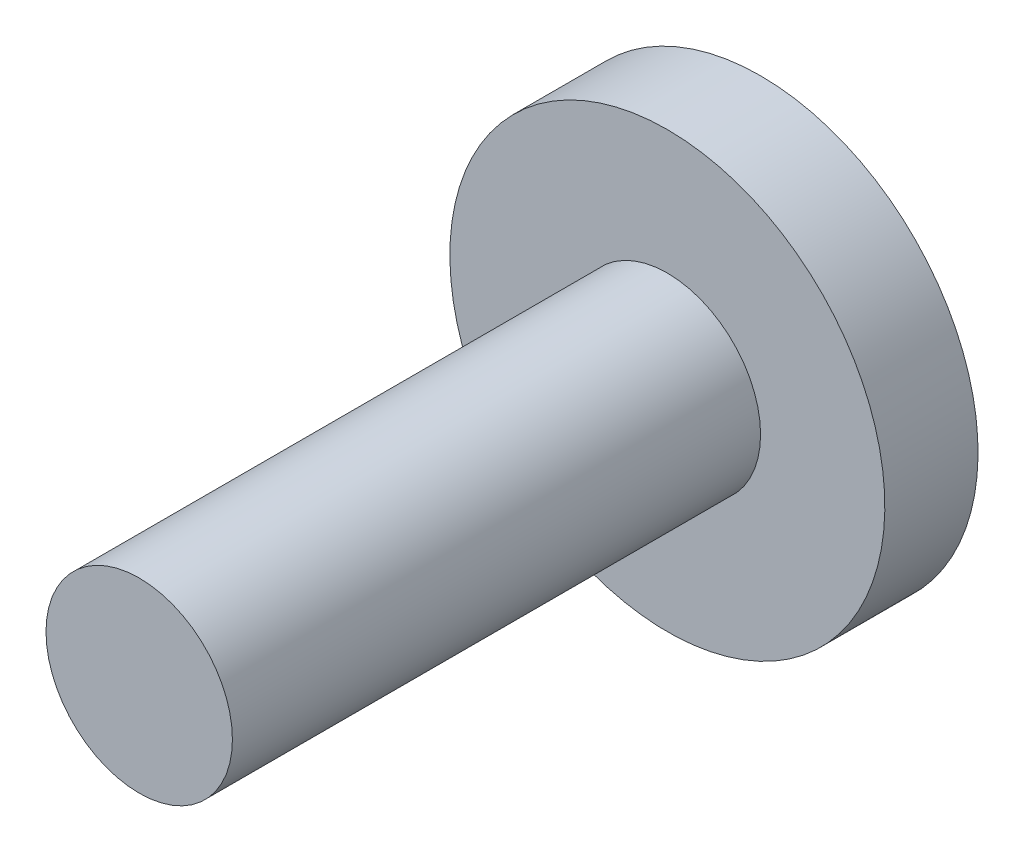
ISO-10303-21;
HEADER;
FILE_DESCRIPTION(('STEP AP214'),'2;1');
FILE_NAME('part.step','',(''),(''),'','','');
FILE_SCHEMA(('AUTOMOTIVE_DESIGN { 1 0 10303 214 1 1 1 1 }'));
ENDSEC;
DATA;
#1=APPLICATION_CONTEXT('core data for automotive mechanical design processes');
#2=APPLICATION_PROTOCOL_DEFINITION('international standard','automotive_design',2000,#1);
#3=PRODUCT_CONTEXT('',#1,'mechanical');
#4=PRODUCT('Part','Part','',(#3));
#5=PRODUCT_RELATED_PRODUCT_CATEGORY('part','',(#4));
#6=PRODUCT_DEFINITION_FORMATION('','',#4);
#7=PRODUCT_DEFINITION_CONTEXT('part definition',#1,'design');
#8=PRODUCT_DEFINITION('design','',#6,#7);
#9=PRODUCT_DEFINITION_SHAPE('','',#8);
#10=(LENGTH_UNIT() NAMED_UNIT(*) SI_UNIT(.MILLI.,.METRE.));
#11=(NAMED_UNIT(*) PLANE_ANGLE_UNIT() SI_UNIT($,.RADIAN.));
#12=(NAMED_UNIT(*) SI_UNIT($,.STERADIAN.) SOLID_ANGLE_UNIT());
#13=UNCERTAINTY_MEASURE_WITH_UNIT(LENGTH_MEASURE(1.E-05),#10,'distance_accuracy_value','');
#14=(GEOMETRIC_REPRESENTATION_CONTEXT(3) GLOBAL_UNCERTAINTY_ASSIGNED_CONTEXT((#13)) GLOBAL_UNIT_ASSIGNED_CONTEXT((#10,
#11,#12)) REPRESENTATION_CONTEXT('',''));
#15=CARTESIAN_POINT('',(0.,0.,0.));
#16=DIRECTION('',(0.,0.,1.));
#17=DIRECTION('',(1.,0.,0.));
#18=AXIS2_PLACEMENT_3D('',#15,#16,#17);
#19=CARTESIAN_POINT('',(131.385564386284,104.456236842962,355.624757541019));
#20=DIRECTION('',(0.,0.,-1.));
#21=DIRECTION('',(0.,-1.,0.));
#22=AXIS2_PLACEMENT_3D('',#19,#20,#21);
#23=PLANE('',#22);
#24=DIRECTION('',(0.,-1.,0.));
#25=VECTOR('',#24,1.);
#26=CARTESIAN_POINT('',(130.135564386284,105.17792467945,355.624757541019));
#27=LINE('',#26,#25);
#28=CARTESIAN_POINT('',(130.135564386284,105.17792467945,355.624757541019));
#29=VERTEX_POINT('',#28);
#30=CARTESIAN_POINT('',(130.135564386284,103.734549006475,355.624757541019));
#31=VERTEX_POINT('',#30);
#32=EDGE_CURVE('E155',#29,#31,#27,.T.);
#33=ORIENTED_EDGE('',*,*,#32,.F.);
#34=DIRECTION('',(-0.866025403784439,-0.5,0.));
#35=VECTOR('',#34,1.);
#36=CARTESIAN_POINT('',(131.385564386284,105.899612515937,355.624757541019));
#37=LINE('',#36,#35);
#38=CARTESIAN_POINT('',(131.385564386284,105.899612515937,355.624757541019));
#39=VERTEX_POINT('',#38);
#40=EDGE_CURVE('E137',#39,#29,#37,.T.);
#41=ORIENTED_EDGE('',*,*,#40,.F.);
#42=DIRECTION('',(-0.866025403784439,0.5,0.));
#43=VECTOR('',#42,1.);
#44=CARTESIAN_POINT('',(132.635564386284,105.17792467945,355.624757541019));
#45=LINE('',#44,#43);
#46=CARTESIAN_POINT('',(132.635564386284,105.17792467945,355.624757541019));
#47=VERTEX_POINT('',#46);
#48=EDGE_CURVE('E135',#47,#39,#45,.T.);
#49=ORIENTED_EDGE('',*,*,#48,.F.);
#50=DIRECTION('',(0.,1.,0.));
#51=VECTOR('',#50,1.);
#52=CARTESIAN_POINT('',(132.635564386284,103.734549006475,355.624757541019));
#53=LINE('',#52,#51);
#54=CARTESIAN_POINT('',(132.635564386284,103.734549006475,355.624757541019));
#55=VERTEX_POINT('',#54);
#56=EDGE_CURVE('E121',#55,#47,#53,.T.);
#57=ORIENTED_EDGE('',*,*,#56,.F.);
#58=DIRECTION('',(-0.866025403784439,-0.5,0.));
#59=VECTOR('',#58,1.);
#60=CARTESIAN_POINT('',(131.385564386284,103.012861169988,355.624757541019));
#61=LINE('',#60,#59);
#62=CARTESIAN_POINT('',(131.385564386284,103.012861169988,355.624757541019));
#63=VERTEX_POINT('',#62);
#64=EDGE_CURVE('E53',#55,#63,#61,.T.);
#65=ORIENTED_EDGE('',*,*,#64,.T.);
#66=DIRECTION('',(-0.866025403784438,0.5,0.));
#67=VECTOR('',#66,1.);
#68=CARTESIAN_POINT('',(130.135564386284,103.734549006475,355.624757541019));
#69=LINE('',#68,#67);
#70=EDGE_CURVE('E11',#63,#31,#69,.T.);
#71=ORIENTED_EDGE('',*,*,#70,.T.);
#72=EDGE_LOOP('',(#33,#41,#49,#57,#65,#71));
#73=FACE_BOUND('',#72,.T.);
#74=ADVANCED_FACE('F42',(#73),#23,.T.);
#75=CARTESIAN_POINT('',(130.135564386284,103.734549006475,351.424757541018));
#76=DIRECTION('',(0.5,0.866025403784438,0.));
#77=DIRECTION('',(0.,0.,-1.));
#78=AXIS2_PLACEMENT_3D('',#75,#76,#77);
#79=PLANE('',#78);
#80=DIRECTION('',(0.,0.,-1.));
#81=VECTOR('',#80,1.);
#82=CARTESIAN_POINT('',(131.385564386284,103.012861169988,351.424757541018));
#83=LINE('',#82,#81);
#84=CARTESIAN_POINT('',(131.385564386284,103.012861169988,354.624757541019));
#85=VERTEX_POINT('',#84);
#86=EDGE_CURVE('E132',#63,#85,#83,.T.);
#87=ORIENTED_EDGE('',*,*,#86,.T.);
#88=DIRECTION('',(-0.866025403784438,0.5,0.));
#89=VECTOR('',#88,1.);
#90=CARTESIAN_POINT('',(130.760564386284,103.373705088232,354.624757541019));
#91=LINE('',#90,#89);
#92=CARTESIAN_POINT('',(130.135564386284,103.734549006475,354.624757541019));
#93=VERTEX_POINT('',#92);
#94=EDGE_CURVE('E165',#85,#93,#91,.T.);
#95=ORIENTED_EDGE('',*,*,#94,.T.);
#96=DIRECTION('',(0.,0.,-1.));
#97=VECTOR('',#96,1.);
#98=CARTESIAN_POINT('',(130.135564386284,103.734549006475,351.424757541018));
#99=LINE('',#98,#97);
#100=EDGE_CURVE('E167',#31,#93,#99,.T.);
#101=ORIENTED_EDGE('',*,*,#100,.F.);
#102=ORIENTED_EDGE('',*,*,#70,.F.);
#103=EDGE_LOOP('',(#87,#95,#101,#102));
#104=FACE_BOUND('',#103,.T.);
#105=ADVANCED_FACE('F44',(#104),#79,.T.);
#106=CARTESIAN_POINT('',(131.385564386284,103.012861169988,351.424757541018));
#107=DIRECTION('',(-0.5,0.866025403784439,0.));
#108=DIRECTION('',(0.,0.,1.));
#109=AXIS2_PLACEMENT_3D('',#106,#107,#108);
#110=PLANE('',#109);
#111=DIRECTION('',(0.,0.,-1.));
#112=VECTOR('',#111,1.);
#113=CARTESIAN_POINT('',(132.635564386284,103.734549006475,351.424757541018));
#114=LINE('',#113,#112);
#115=CARTESIAN_POINT('',(132.635564386284,103.734549006475,354.624757541019));
#116=VERTEX_POINT('',#115);
#117=EDGE_CURVE('E129',#55,#116,#114,.T.);
#118=ORIENTED_EDGE('',*,*,#117,.T.);
#119=DIRECTION('',(-0.866025403784439,-0.5,0.));
#120=VECTOR('',#119,1.);
#121=CARTESIAN_POINT('',(132.010564386284,103.373705088232,354.624757541019));
#122=LINE('',#121,#120);
#123=EDGE_CURVE('E160',#116,#85,#122,.T.);
#124=ORIENTED_EDGE('',*,*,#123,.T.);
#125=ORIENTED_EDGE('',*,*,#86,.F.);
#126=ORIENTED_EDGE('',*,*,#64,.F.);
#127=EDGE_LOOP('',(#118,#124,#125,#126));
#128=FACE_BOUND('',#127,.T.);
#129=ADVANCED_FACE('F215',(#128),#110,.T.);
#130=CARTESIAN_POINT('',(132.635564386284,103.734549006475,351.424757541018));
#131=DIRECTION('',(-1.,0.,0.));
#132=DIRECTION('',(0.,0.,1.));
#133=AXIS2_PLACEMENT_3D('',#130,#131,#132);
#134=PLANE('',#133);
#135=DIRECTION('',(0.,0.,-1.));
#136=VECTOR('',#135,1.);
#137=CARTESIAN_POINT('',(132.635564386284,105.177924679449,351.424757541018));
#138=LINE('',#137,#136);
#139=CARTESIAN_POINT('',(132.635564386284,105.177924679449,354.624757541019));
#140=VERTEX_POINT('',#139);
#141=EDGE_CURVE('E126',#47,#140,#138,.T.);
#142=ORIENTED_EDGE('',*,*,#141,.T.);
#143=DIRECTION('',(0.,-1.,0.));
#144=VECTOR('',#143,1.);
#145=CARTESIAN_POINT('',(132.635564386284,104.456236842962,354.624757541019));
#146=LINE('',#145,#144);
#147=EDGE_CURVE('E164',#140,#116,#146,.T.);
#148=ORIENTED_EDGE('',*,*,#147,.T.);
#149=ORIENTED_EDGE('',*,*,#117,.F.);
#150=ORIENTED_EDGE('',*,*,#56,.T.);
#151=EDGE_LOOP('',(#142,#148,#149,#150));
#152=FACE_BOUND('',#151,.T.);
#153=ADVANCED_FACE('F123',(#152),#134,.T.);
#154=CARTESIAN_POINT('',(132.635564386284,105.177924679449,351.424757541018));
#155=DIRECTION('',(-0.5,-0.866025403784439,0.));
#156=DIRECTION('',(-0.866025403784439,0.5,0.));
#157=AXIS2_PLACEMENT_3D('',#154,#155,#156);
#158=PLANE('',#157);
#159=DIRECTION('',(0.,0.,-1.));
#160=VECTOR('',#159,1.);
#161=CARTESIAN_POINT('',(131.385564386284,105.899612515937,351.424757541018));
#162=LINE('',#161,#160);
#163=CARTESIAN_POINT('',(131.385564386284,105.899612515937,354.624757541019));
#164=VERTEX_POINT('',#163);
#165=EDGE_CURVE('E151',#39,#164,#162,.T.);
#166=ORIENTED_EDGE('',*,*,#165,.T.);
#167=DIRECTION('',(0.866025403784439,-0.5,0.));
#168=VECTOR('',#167,1.);
#169=CARTESIAN_POINT('',(132.010564386284,105.538768597693,354.624757541019));
#170=LINE('',#169,#168);
#171=EDGE_CURVE('E144',#164,#140,#170,.T.);
#172=ORIENTED_EDGE('',*,*,#171,.T.);
#173=ORIENTED_EDGE('',*,*,#141,.F.);
#174=ORIENTED_EDGE('',*,*,#48,.T.);
#175=EDGE_LOOP('',(#166,#172,#173,#174));
#176=FACE_BOUND('',#175,.T.);
#177=ADVANCED_FACE('F142',(#176),#158,.T.);
#178=CARTESIAN_POINT('',(131.385564386284,105.899612515937,351.424757541018));
#179=DIRECTION('',(0.5,-0.866025403784439,0.));
#180=DIRECTION('',(0.,0.,-1.));
#181=AXIS2_PLACEMENT_3D('',#178,#179,#180);
#182=PLANE('',#181);
#183=DIRECTION('',(0.,0.,-1.));
#184=VECTOR('',#183,1.);
#185=CARTESIAN_POINT('',(130.135564386284,105.17792467945,351.424757541018));
#186=LINE('',#185,#184);
#187=CARTESIAN_POINT('',(130.135564386284,105.17792467945,354.624757541019));
#188=VERTEX_POINT('',#187);
#189=EDGE_CURVE('E159',#29,#188,#186,.T.);
#190=ORIENTED_EDGE('',*,*,#189,.T.);
#191=DIRECTION('',(0.866025403784439,0.5,0.));
#192=VECTOR('',#191,1.);
#193=CARTESIAN_POINT('',(130.760564386284,105.538768597693,354.624757541019));
#194=LINE('',#193,#192);
#195=EDGE_CURVE('E182',#188,#164,#194,.T.);
#196=ORIENTED_EDGE('',*,*,#195,.T.);
#197=ORIENTED_EDGE('',*,*,#165,.F.);
#198=ORIENTED_EDGE('',*,*,#40,.T.);
#199=EDGE_LOOP('',(#190,#196,#197,#198));
#200=FACE_BOUND('',#199,.T.);
#201=ADVANCED_FACE('F266',(#200),#182,.T.);
#202=CARTESIAN_POINT('',(130.135564386284,105.17792467945,351.424757541018));
#203=DIRECTION('',(1.,0.,0.));
#204=DIRECTION('',(0.,1.,0.));
#205=AXIS2_PLACEMENT_3D('',#202,#203,#204);
#206=PLANE('',#205);
#207=ORIENTED_EDGE('',*,*,#100,.T.);
#208=DIRECTION('',(0.,1.,0.));
#209=VECTOR('',#208,1.);
#210=CARTESIAN_POINT('',(130.135564386284,104.456236842962,354.624757541019));
#211=LINE('',#210,#209);
#212=EDGE_CURVE('E178',#93,#188,#211,.T.);
#213=ORIENTED_EDGE('',*,*,#212,.T.);
#214=ORIENTED_EDGE('',*,*,#189,.F.);
#215=ORIENTED_EDGE('',*,*,#32,.T.);
#216=EDGE_LOOP('',(#207,#213,#214,#215));
#217=FACE_BOUND('',#216,.T.);
#218=ADVANCED_FACE('F213',(#217),#206,.T.);
#219=CARTESIAN_POINT('',(131.385564386284,104.456236842962,364.624757541019));
#220=DIRECTION('',(0.,0.,1.));
#221=DIRECTION('',(1.,0.,0.));
#222=AXIS2_PLACEMENT_3D('',#219,#220,#221);
#223=PLANE('',#222);
#224=CARTESIAN_POINT('',(131.385564386284,104.456236842962,364.624757541019));
#225=DIRECTION('',(0.,0.,-1.));
#226=DIRECTION('',(0.,1.,0.));
#227=AXIS2_PLACEMENT_3D('',#224,#225,#226);
#228=CIRCLE('',#227,1.5);
#229=CARTESIAN_POINT('',(131.385564386284,105.956236842962,364.624757541019));
#230=VERTEX_POINT('',#229);
#231=EDGE_CURVE('E172',#230,#230,#228,.T.);
#232=ORIENTED_EDGE('',*,*,#231,.F.);
#233=EDGE_LOOP('',(#232));
#234=FACE_BOUND('',#233,.T.);
#235=ADVANCED_FACE('F264',(#234),#223,.T.);
#236=CARTESIAN_POINT('',(131.385564386284,104.456236842962,364.624757541019));
#237=DIRECTION('',(0.,0.,-1.));
#238=DIRECTION('',(1.,0.,0.));
#239=AXIS2_PLACEMENT_3D('',#236,#237,#238);
#240=CYLINDRICAL_SURFACE('',#239,1.5);
#241=CARTESIAN_POINT('',(131.385564386284,104.456236842962,356.124757541019));
#242=DIRECTION('',(0.,0.,-1.));
#243=DIRECTION('',(0.,1.,0.));
#244=AXIS2_PLACEMENT_3D('',#241,#242,#243);
#245=CIRCLE('',#244,1.5);
#246=CARTESIAN_POINT('',(131.385564386284,105.956236842962,356.124757541019));
#247=VERTEX_POINT('',#246);
#248=EDGE_CURVE('E169',#247,#247,#245,.T.);
#249=ORIENTED_EDGE('',*,*,#248,.F.);
#250=EDGE_LOOP('',(#249));
#251=FACE_BOUND('',#250,.T.);
#252=ORIENTED_EDGE('',*,*,#231,.T.);
#253=EDGE_LOOP('',(#252));
#254=FACE_BOUND('',#253,.T.);
#255=ADVANCED_FACE('F258',(#251,#254),#240,.T.);
#256=CARTESIAN_POINT('',(131.385564386284,104.456236842962,356.124757541019));
#257=DIRECTION('',(0.,0.,-1.));
#258=DIRECTION('',(0.,-1.,0.));
#259=AXIS2_PLACEMENT_3D('',#256,#257,#258);
#260=PLANE('',#259);
#261=CARTESIAN_POINT('',(131.385564386284,104.456236842962,356.124757541019));
#262=DIRECTION('',(0.,0.,-1.));
#263=DIRECTION('',(0.,1.,0.));
#264=AXIS2_PLACEMENT_3D('',#261,#262,#263);
#265=CIRCLE('',#264,3.5);
#266=CARTESIAN_POINT('',(131.385564386284,107.956236842962,356.124757541019));
#267=VERTEX_POINT('',#266);
#268=EDGE_CURVE('E46',#267,#267,#265,.T.);
#269=ORIENTED_EDGE('',*,*,#268,.F.);
#270=EDGE_LOOP('',(#269));
#271=FACE_BOUND('',#270,.T.);
#272=ORIENTED_EDGE('',*,*,#248,.T.);
#273=EDGE_LOOP('',(#272));
#274=FACE_BOUND('',#273,.T.);
#275=ADVANCED_FACE('F254',(#271,#274),#260,.F.);
#276=CARTESIAN_POINT('',(131.385564386284,104.456236842962,356.124757541019));
#277=DIRECTION('',(0.,0.,-1.));
#278=DIRECTION('',(-1.,0.,0.));
#279=AXIS2_PLACEMENT_3D('',#276,#277,#278);
#280=CYLINDRICAL_SURFACE('',#279,3.5);
#281=CARTESIAN_POINT('',(131.385564386284,104.456236842962,354.624757541019));
#282=DIRECTION('',(0.,0.,-1.));
#283=DIRECTION('',(0.,1.,0.));
#284=AXIS2_PLACEMENT_3D('',#281,#282,#283);
#285=CIRCLE('',#284,3.5);
#286=CARTESIAN_POINT('',(131.385564386284,107.956236842962,354.624757541019));
#287=VERTEX_POINT('',#286);
#288=EDGE_CURVE('E173',#287,#287,#285,.T.);
#289=ORIENTED_EDGE('',*,*,#288,.F.);
#290=EDGE_LOOP('',(#289));
#291=FACE_BOUND('',#290,.T.);
#292=ORIENTED_EDGE('',*,*,#268,.T.);
#293=EDGE_LOOP('',(#292));
#294=FACE_BOUND('',#293,.T.);
#295=ADVANCED_FACE('F251',(#291,#294),#280,.T.);
#296=CARTESIAN_POINT('',(131.385564386284,104.456236842962,354.624757541019));
#297=DIRECTION('',(0.,0.,-1.));
#298=DIRECTION('',(0.,-1.,0.));
#299=AXIS2_PLACEMENT_3D('',#296,#297,#298);
#300=PLANE('',#299);
#301=ORIENTED_EDGE('',*,*,#94,.F.);
#302=ORIENTED_EDGE('',*,*,#123,.F.);
#303=ORIENTED_EDGE('',*,*,#147,.F.);
#304=ORIENTED_EDGE('',*,*,#171,.F.);
#305=ORIENTED_EDGE('',*,*,#195,.F.);
#306=ORIENTED_EDGE('',*,*,#212,.F.);
#307=EDGE_LOOP('',(#301,#302,#303,#304,#305,#306));
#308=FACE_BOUND('',#307,.T.);
#309=ORIENTED_EDGE('',*,*,#288,.T.);
#310=EDGE_LOOP('',(#309));
#311=FACE_BOUND('',#310,.T.);
#312=ADVANCED_FACE('F209',(#308,#311),#300,.T.);
#313=CLOSED_SHELL('',(#74,#105,#129,#153,#177,#201,#218,#235,#255,#275,#295,#312));
#314=MANIFOLD_SOLID_BREP('B2',#313);
#315=ADVANCED_BREP_SHAPE_REPRESENTATION('',(#18,#314),#14);
#316=SHAPE_DEFINITION_REPRESENTATION(#9,#315);
ENDSEC;
END-ISO-10303-21;
